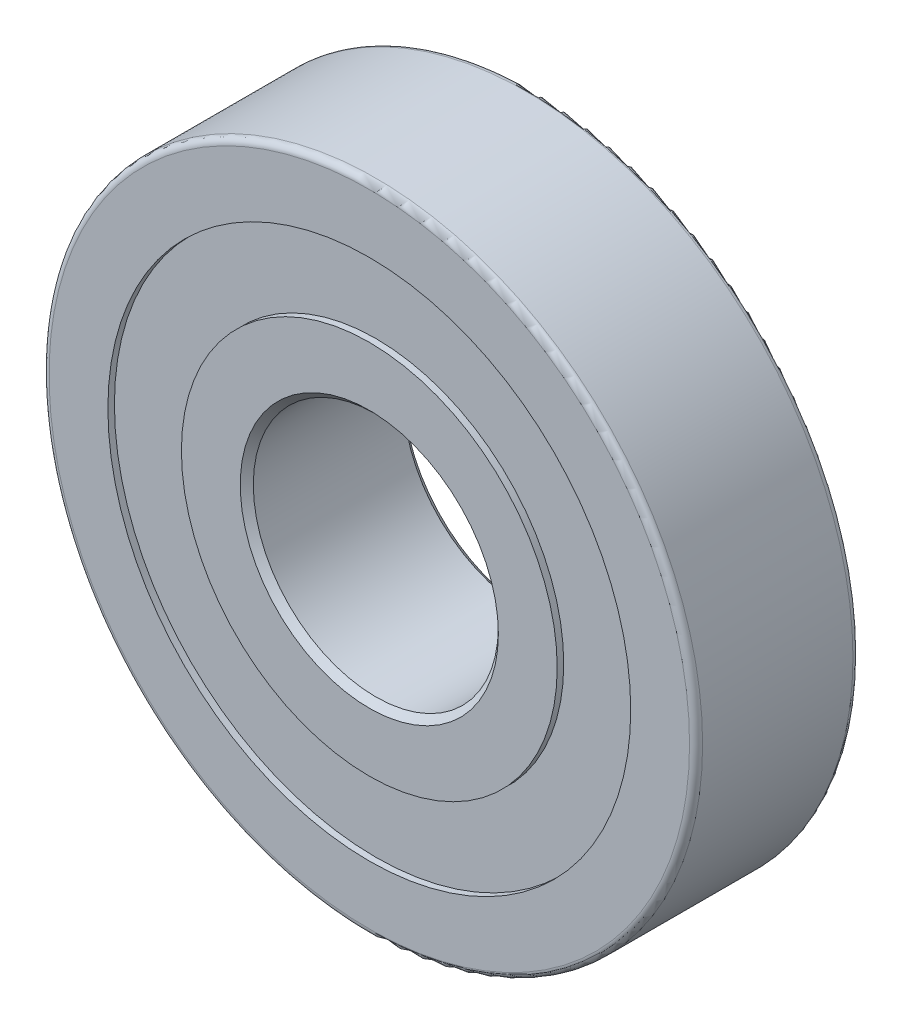
ISO-10303-21;
HEADER;
FILE_DESCRIPTION(('STEP AP214'),'2;1');
FILE_NAME('part.step','',(''),(''),'','','');
FILE_SCHEMA(('AUTOMOTIVE_DESIGN { 1 0 10303 214 1 1 1 1 }'));
ENDSEC;
DATA;
#1=APPLICATION_CONTEXT('core data for automotive mechanical design processes');
#2=APPLICATION_PROTOCOL_DEFINITION('international standard','automotive_design',2000,#1);
#3=PRODUCT_CONTEXT('',#1,'mechanical');
#4=PRODUCT('Part','Part','',(#3));
#5=PRODUCT_RELATED_PRODUCT_CATEGORY('part','',(#4));
#6=PRODUCT_DEFINITION_FORMATION('','',#4);
#7=PRODUCT_DEFINITION_CONTEXT('part definition',#1,'design');
#8=PRODUCT_DEFINITION('design','',#6,#7);
#9=PRODUCT_DEFINITION_SHAPE('','',#8);
#10=(LENGTH_UNIT() NAMED_UNIT(*) SI_UNIT(.MILLI.,.METRE.));
#11=(NAMED_UNIT(*) PLANE_ANGLE_UNIT() SI_UNIT($,.RADIAN.));
#12=(NAMED_UNIT(*) SI_UNIT($,.STERADIAN.) SOLID_ANGLE_UNIT());
#13=UNCERTAINTY_MEASURE_WITH_UNIT(LENGTH_MEASURE(1.E-05),#10,'distance_accuracy_value','');
#14=(GEOMETRIC_REPRESENTATION_CONTEXT(3) GLOBAL_UNCERTAINTY_ASSIGNED_CONTEXT((#13)) GLOBAL_UNIT_ASSIGNED_CONTEXT((#10,
#11,#12)) REPRESENTATION_CONTEXT('',''));
#15=CARTESIAN_POINT('',(0.,0.,0.));
#16=DIRECTION('',(0.,0.,1.));
#17=DIRECTION('',(1.,0.,0.));
#18=AXIS2_PLACEMENT_3D('',#15,#16,#17);
#19=CARTESIAN_POINT('',(0.,0.,1.5875));
#20=DIRECTION('',(0.,0.,-1.));
#21=DIRECTION('',(-1.,0.,0.));
#22=AXIS2_PLACEMENT_3D('',#19,#20,#21);
#23=CYLINDRICAL_SURFACE('',#22,2.38125);
#24=CARTESIAN_POINT('',(0.,0.,1.46050000006426));
#25=DIRECTION('',(0.,0.,1.));
#26=DIRECTION('',(1.,0.,0.));
#27=AXIS2_PLACEMENT_3D('',#24,#25,#26);
#28=CIRCLE('',#27,2.3812499999849);
#29=CARTESIAN_POINT('',(2.3812499999849,0.,1.46050000006426));
#30=VERTEX_POINT('',#29);
#31=EDGE_CURVE('E169',#30,#30,#28,.T.);
#32=ORIENTED_EDGE('',*,*,#31,.T.);
#33=EDGE_LOOP('',(#32));
#34=FACE_BOUND('',#33,.T.);
#35=CARTESIAN_POINT('',(0.,0.,-1.46050000000741));
#36=DIRECTION('',(0.,0.,-1.));
#37=DIRECTION('',(-1.,0.,0.));
#38=AXIS2_PLACEMENT_3D('',#35,#36,#37);
#39=CIRCLE('',#38,2.38124999992806);
#40=CARTESIAN_POINT('',(-2.38124999992806,0.,-1.46050000000741));
#41=VERTEX_POINT('',#40);
#42=EDGE_CURVE('E172',#41,#41,#39,.T.);
#43=ORIENTED_EDGE('',*,*,#42,.T.);
#44=EDGE_LOOP('',(#43));
#45=FACE_BOUND('',#44,.T.);
#46=ADVANCED_FACE('F15',(#34,#45),#23,.F.);
#47=CARTESIAN_POINT('',(0.,0.,-1.58749999997099));
#48=DIRECTION('',(0.,0.,-1.));
#49=DIRECTION('',(0.,1.,0.));
#50=AXIS2_PLACEMENT_3D('',#47,#48,#49);
#51=CONICAL_SURFACE('',#50,2.50824999994848,0.785398163621241);
#52=CARTESIAN_POINT('',(0.,0.,-1.58749999997099));
#53=DIRECTION('',(0.,0.,-1.));
#54=DIRECTION('',(0.,1.,0.));
#55=AXIS2_PLACEMENT_3D('',#52,#53,#54);
#56=CIRCLE('',#55,2.50824999994848);
#57=CARTESIAN_POINT('',(0.,2.50824999994848,-1.58749999997099));
#58=VERTEX_POINT('',#57);
#59=EDGE_CURVE('E18',#58,#58,#56,.T.);
#60=ORIENTED_EDGE('',*,*,#59,.T.);
#61=EDGE_LOOP('',(#60));
#62=FACE_BOUND('',#61,.T.);
#63=ORIENTED_EDGE('',*,*,#42,.F.);
#64=EDGE_LOOP('',(#63));
#65=FACE_BOUND('',#64,.T.);
#66=ADVANCED_FACE('F117',(#62,#65),#51,.F.);
#67=CARTESIAN_POINT('',(0.,0.,1.58750000002783));
#68=DIRECTION('',(0.,0.,1.));
#69=DIRECTION('',(1.,0.,0.));
#70=AXIS2_PLACEMENT_3D('',#67,#68,#69);
#71=CONICAL_SURFACE('',#70,2.50825000000532,0.785398163621241);
#72=ORIENTED_EDGE('',*,*,#31,.F.);
#73=EDGE_LOOP('',(#72));
#74=FACE_BOUND('',#73,.T.);
#75=CARTESIAN_POINT('',(0.,0.,1.58750000002783));
#76=DIRECTION('',(0.,0.,1.));
#77=DIRECTION('',(1.,0.,0.));
#78=AXIS2_PLACEMENT_3D('',#75,#76,#77);
#79=CIRCLE('',#78,2.50825000000532);
#80=CARTESIAN_POINT('',(2.50825000000532,0.,1.58750000002783));
#81=VERTEX_POINT('',#80);
#82=EDGE_CURVE('E165',#81,#81,#79,.F.);
#83=ORIENTED_EDGE('',*,*,#82,.F.);
#84=EDGE_LOOP('',(#83));
#85=FACE_BOUND('',#84,.T.);
#86=ADVANCED_FACE('F114',(#74,#85),#71,.F.);
#87=CARTESIAN_POINT('',(0.,0.,-1.5875));
#88=DIRECTION('',(0.,0.,1.));
#89=DIRECTION('',(1.,0.,0.));
#90=AXIS2_PLACEMENT_3D('',#87,#88,#89);
#91=PLANE('',#90);
#92=CARTESIAN_POINT('',(0.,0.,-1.5875));
#93=DIRECTION('',(0.,0.,-1.));
#94=DIRECTION('',(-1.,0.,0.));
#95=AXIS2_PLACEMENT_3D('',#92,#93,#94);
#96=CIRCLE('',#95,3.65125);
#97=CARTESIAN_POINT('',(-3.65125,0.,-1.5875));
#98=VERTEX_POINT('',#97);
#99=EDGE_CURVE('E163',#98,#98,#96,.F.);
#100=ORIENTED_EDGE('',*,*,#99,.F.);
#101=EDGE_LOOP('',(#100));
#102=FACE_BOUND('',#101,.T.);
#103=ORIENTED_EDGE('',*,*,#59,.F.);
#104=EDGE_LOOP('',(#103));
#105=FACE_BOUND('',#104,.T.);
#106=ADVANCED_FACE('F110',(#102,#105),#91,.F.);
#107=CARTESIAN_POINT('',(0.,0.,1.5875));
#108=DIRECTION('',(0.,0.,1.));
#109=DIRECTION('',(1.,0.,0.));
#110=AXIS2_PLACEMENT_3D('',#107,#108,#109);
#111=PLANE('',#110);
#112=CARTESIAN_POINT('',(0.,0.,1.5875));
#113=DIRECTION('',(0.,0.,-1.));
#114=DIRECTION('',(-1.,0.,0.));
#115=AXIS2_PLACEMENT_3D('',#112,#113,#114);
#116=CIRCLE('',#115,3.65125);
#117=CARTESIAN_POINT('',(-3.65125,0.,1.5875));
#118=VERTEX_POINT('',#117);
#119=EDGE_CURVE('E160',#118,#118,#116,.T.);
#120=ORIENTED_EDGE('',*,*,#119,.F.);
#121=EDGE_LOOP('',(#120));
#122=FACE_BOUND('',#121,.T.);
#123=ORIENTED_EDGE('',*,*,#82,.T.);
#124=EDGE_LOOP('',(#123));
#125=FACE_BOUND('',#124,.T.);
#126=ADVANCED_FACE('F106',(#122,#125),#111,.T.);
#127=CARTESIAN_POINT('',(0.,0.,1.5875));
#128=DIRECTION('',(0.,0.,-1.));
#129=DIRECTION('',(-1.,0.,0.));
#130=AXIS2_PLACEMENT_3D('',#127,#128,#129);
#131=CYLINDRICAL_SURFACE('',#130,3.65125);
#132=CARTESIAN_POINT('',(0.,0.,-1.4605));
#133=DIRECTION('',(0.,0.,-1.));
#134=DIRECTION('',(-1.,0.,0.));
#135=AXIS2_PLACEMENT_3D('',#132,#133,#134);
#136=CIRCLE('',#135,3.65125);
#137=CARTESIAN_POINT('',(-3.65125,0.,-1.4605));
#138=VERTEX_POINT('',#137);
#139=EDGE_CURVE('E157',#138,#138,#136,.T.);
#140=ORIENTED_EDGE('',*,*,#139,.T.);
#141=EDGE_LOOP('',(#140));
#142=FACE_BOUND('',#141,.T.);
#143=ORIENTED_EDGE('',*,*,#99,.T.);
#144=EDGE_LOOP('',(#143));
#145=FACE_BOUND('',#144,.T.);
#146=ADVANCED_FACE('F102',(#142,#145),#131,.T.);
#147=CARTESIAN_POINT('',(0.,0.,1.5875));
#148=DIRECTION('',(0.,0.,-1.));
#149=DIRECTION('',(-1.,0.,0.));
#150=AXIS2_PLACEMENT_3D('',#147,#148,#149);
#151=CYLINDRICAL_SURFACE('',#150,3.65125);
#152=ORIENTED_EDGE('',*,*,#119,.T.);
#153=EDGE_LOOP('',(#152));
#154=FACE_BOUND('',#153,.T.);
#155=CARTESIAN_POINT('',(0.,0.,1.4605));
#156=DIRECTION('',(0.,0.,-1.));
#157=DIRECTION('',(-1.,0.,0.));
#158=AXIS2_PLACEMENT_3D('',#155,#156,#157);
#159=CIRCLE('',#158,3.65125);
#160=CARTESIAN_POINT('',(-3.65125,0.,1.4605));
#161=VERTEX_POINT('',#160);
#162=EDGE_CURVE('E154',#161,#161,#159,.T.);
#163=ORIENTED_EDGE('',*,*,#162,.F.);
#164=EDGE_LOOP('',(#163));
#165=FACE_BOUND('',#164,.T.);
#166=ADVANCED_FACE('F98',(#154,#165),#151,.T.);
#167=CARTESIAN_POINT('',(0.,0.,-1.4605));
#168=DIRECTION('',(0.,0.,1.));
#169=DIRECTION('',(1.,0.,0.));
#170=AXIS2_PLACEMENT_3D('',#167,#168,#169);
#171=PLANE('',#170);
#172=ORIENTED_EDGE('',*,*,#139,.F.);
#173=EDGE_LOOP('',(#172));
#174=FACE_BOUND('',#173,.T.);
#175=CARTESIAN_POINT('',(0.,0.,-1.4605));
#176=DIRECTION('',(0.,0.,-1.));
#177=DIRECTION('',(-1.,0.,0.));
#178=AXIS2_PLACEMENT_3D('',#175,#176,#177);
#179=CIRCLE('',#178,5.08);
#180=CARTESIAN_POINT('',(-5.08,0.,-1.4605));
#181=VERTEX_POINT('',#180);
#182=EDGE_CURVE('E151',#181,#181,#179,.T.);
#183=ORIENTED_EDGE('',*,*,#182,.T.);
#184=EDGE_LOOP('',(#183));
#185=FACE_BOUND('',#184,.T.);
#186=ADVANCED_FACE('F94',(#174,#185),#171,.F.);
#187=CARTESIAN_POINT('',(0.,0.,1.4605));
#188=DIRECTION('',(0.,0.,1.));
#189=DIRECTION('',(1.,0.,0.));
#190=AXIS2_PLACEMENT_3D('',#187,#188,#189);
#191=PLANE('',#190);
#192=ORIENTED_EDGE('',*,*,#162,.T.);
#193=EDGE_LOOP('',(#192));
#194=FACE_BOUND('',#193,.T.);
#195=CARTESIAN_POINT('',(0.,0.,1.4605));
#196=DIRECTION('',(0.,0.,-1.));
#197=DIRECTION('',(-1.,0.,0.));
#198=AXIS2_PLACEMENT_3D('',#195,#196,#197);
#199=CIRCLE('',#198,5.08);
#200=CARTESIAN_POINT('',(-5.08,0.,1.4605));
#201=VERTEX_POINT('',#200);
#202=EDGE_CURVE('E143',#201,#201,#199,.F.);
#203=ORIENTED_EDGE('',*,*,#202,.T.);
#204=EDGE_LOOP('',(#203));
#205=FACE_BOUND('',#204,.T.);
#206=ADVANCED_FACE('F90',(#194,#205),#191,.T.);
#207=CARTESIAN_POINT('',(0.,0.,1.5875));
#208=DIRECTION('',(0.,0.,-1.));
#209=DIRECTION('',(-1.,0.,0.));
#210=AXIS2_PLACEMENT_3D('',#207,#208,#209);
#211=CYLINDRICAL_SURFACE('',#210,5.08);
#212=ORIENTED_EDGE('',*,*,#182,.F.);
#213=EDGE_LOOP('',(#212));
#214=FACE_BOUND('',#213,.T.);
#215=CARTESIAN_POINT('',(0.,0.,-1.5875));
#216=DIRECTION('',(0.,0.,-1.));
#217=DIRECTION('',(-1.,0.,0.));
#218=AXIS2_PLACEMENT_3D('',#215,#216,#217);
#219=CIRCLE('',#218,5.08);
#220=CARTESIAN_POINT('',(-5.08,0.,-1.5875));
#221=VERTEX_POINT('',#220);
#222=EDGE_CURVE('E138',#221,#221,#219,.T.);
#223=ORIENTED_EDGE('',*,*,#222,.T.);
#224=EDGE_LOOP('',(#223));
#225=FACE_BOUND('',#224,.T.);
#226=ADVANCED_FACE('F86',(#214,#225),#211,.F.);
#227=CARTESIAN_POINT('',(0.,0.,1.5875));
#228=DIRECTION('',(0.,0.,-1.));
#229=DIRECTION('',(-1.,0.,0.));
#230=AXIS2_PLACEMENT_3D('',#227,#228,#229);
#231=CYLINDRICAL_SURFACE('',#230,5.08);
#232=CARTESIAN_POINT('',(0.,0.,1.5875));
#233=DIRECTION('',(0.,0.,-1.));
#234=DIRECTION('',(-1.,0.,0.));
#235=AXIS2_PLACEMENT_3D('',#232,#233,#234);
#236=CIRCLE('',#235,5.08);
#237=CARTESIAN_POINT('',(-5.08,0.,1.5875));
#238=VERTEX_POINT('',#237);
#239=EDGE_CURVE('E136',#238,#238,#236,.T.);
#240=ORIENTED_EDGE('',*,*,#239,.F.);
#241=EDGE_LOOP('',(#240));
#242=FACE_BOUND('',#241,.T.);
#243=ORIENTED_EDGE('',*,*,#202,.F.);
#244=EDGE_LOOP('',(#243));
#245=FACE_BOUND('',#244,.T.);
#246=ADVANCED_FACE('F81',(#242,#245),#231,.F.);
#247=CARTESIAN_POINT('',(0.,0.,-1.5875));
#248=DIRECTION('',(0.,0.,1.));
#249=DIRECTION('',(1.,0.,0.));
#250=AXIS2_PLACEMENT_3D('',#247,#248,#249);
#251=PLANE('',#250);
#252=ORIENTED_EDGE('',*,*,#222,.F.);
#253=EDGE_LOOP('',(#252));
#254=FACE_BOUND('',#253,.T.);
#255=CARTESIAN_POINT('',(0.,0.,-1.5875));
#256=DIRECTION('',(0.,0.,1.));
#257=DIRECTION('',(1.,0.,0.));
#258=AXIS2_PLACEMENT_3D('',#255,#256,#257);
#259=CIRCLE('',#258,6.223);
#260=CARTESIAN_POINT('',(6.223,0.,-1.5875));
#261=VERTEX_POINT('',#260);
#262=EDGE_CURVE('E65',#261,#261,#259,.T.);
#263=ORIENTED_EDGE('',*,*,#262,.F.);
#264=EDGE_LOOP('',(#263));
#265=FACE_BOUND('',#264,.T.);
#266=ADVANCED_FACE('F71',(#254,#265),#251,.F.);
#267=CARTESIAN_POINT('',(0.,0.,1.5875));
#268=DIRECTION('',(0.,0.,1.));
#269=DIRECTION('',(1.,0.,0.));
#270=AXIS2_PLACEMENT_3D('',#267,#268,#269);
#271=PLANE('',#270);
#272=ORIENTED_EDGE('',*,*,#239,.T.);
#273=EDGE_LOOP('',(#272));
#274=FACE_BOUND('',#273,.T.);
#275=CARTESIAN_POINT('',(0.,0.,1.5875));
#276=DIRECTION('',(0.,0.,-1.));
#277=DIRECTION('',(1.,0.,0.));
#278=AXIS2_PLACEMENT_3D('',#275,#276,#277);
#279=CIRCLE('',#278,6.223);
#280=CARTESIAN_POINT('',(6.223,0.,1.5875));
#281=VERTEX_POINT('',#280);
#282=EDGE_CURVE('E27',#281,#281,#279,.T.);
#283=ORIENTED_EDGE('',*,*,#282,.F.);
#284=EDGE_LOOP('',(#283));
#285=FACE_BOUND('',#284,.T.);
#286=ADVANCED_FACE('F80',(#274,#285),#271,.T.);
#287=CARTESIAN_POINT('',(0.,0.,-1.4605));
#288=DIRECTION('',(0.,0.,1.));
#289=DIRECTION('',(1.,0.,0.));
#290=AXIS2_PLACEMENT_3D('',#287,#288,#289);
#291=TOROIDAL_SURFACE('',#290,6.223,0.127);
#292=CARTESIAN_POINT('',(0.,0.,-1.4605));
#293=DIRECTION('',(0.,0.,-1.));
#294=DIRECTION('',(-1.,0.,0.));
#295=AXIS2_PLACEMENT_3D('',#292,#293,#294);
#296=CIRCLE('',#295,6.35);
#297=CARTESIAN_POINT('',(-6.35,0.,-1.4605));
#298=VERTEX_POINT('',#297);
#299=EDGE_CURVE('E22',#298,#298,#296,.F.);
#300=ORIENTED_EDGE('',*,*,#299,.F.);
#301=EDGE_LOOP('',(#300));
#302=FACE_BOUND('',#301,.T.);
#303=ORIENTED_EDGE('',*,*,#262,.T.);
#304=EDGE_LOOP('',(#303));
#305=FACE_BOUND('',#304,.T.);
#306=ADVANCED_FACE('F45',(#302,#305),#291,.T.);
#307=CARTESIAN_POINT('',(0.,0.,1.4605));
#308=DIRECTION('',(0.,0.,1.));
#309=DIRECTION('',(1.,0.,0.));
#310=AXIS2_PLACEMENT_3D('',#307,#308,#309);
#311=TOROIDAL_SURFACE('',#310,6.223,0.127);
#312=ORIENTED_EDGE('',*,*,#282,.T.);
#313=EDGE_LOOP('',(#312));
#314=FACE_BOUND('',#313,.T.);
#315=CARTESIAN_POINT('',(0.,0.,1.4605));
#316=DIRECTION('',(0.,0.,-1.));
#317=DIRECTION('',(-1.,0.,0.));
#318=AXIS2_PLACEMENT_3D('',#315,#316,#317);
#319=CIRCLE('',#318,6.35);
#320=CARTESIAN_POINT('',(-6.35,0.,1.4605));
#321=VERTEX_POINT('',#320);
#322=EDGE_CURVE('E10',#321,#321,#319,.T.);
#323=ORIENTED_EDGE('',*,*,#322,.F.);
#324=EDGE_LOOP('',(#323));
#325=FACE_BOUND('',#324,.T.);
#326=ADVANCED_FACE('F39',(#314,#325),#311,.T.);
#327=CARTESIAN_POINT('',(0.,0.,1.5875));
#328=DIRECTION('',(0.,0.,-1.));
#329=DIRECTION('',(-1.,0.,0.));
#330=AXIS2_PLACEMENT_3D('',#327,#328,#329);
#331=CYLINDRICAL_SURFACE('',#330,6.35);
#332=ORIENTED_EDGE('',*,*,#322,.T.);
#333=EDGE_LOOP('',(#332));
#334=FACE_BOUND('',#333,.T.);
#335=ORIENTED_EDGE('',*,*,#299,.T.);
#336=EDGE_LOOP('',(#335));
#337=FACE_BOUND('',#336,.T.);
#338=ADVANCED_FACE('F44',(#334,#337),#331,.T.);
#339=CLOSED_SHELL('',(#46,#66,#86,#106,#126,#146,#166,#186,#206,#226,#246,#266,#286,#306,#326,#338));
#340=MANIFOLD_SOLID_BREP('B1',#339);
#341=ADVANCED_BREP_SHAPE_REPRESENTATION('',(#18,#340),#14);
#342=SHAPE_DEFINITION_REPRESENTATION(#9,#341);
ENDSEC;
END-ISO-10303-21;
